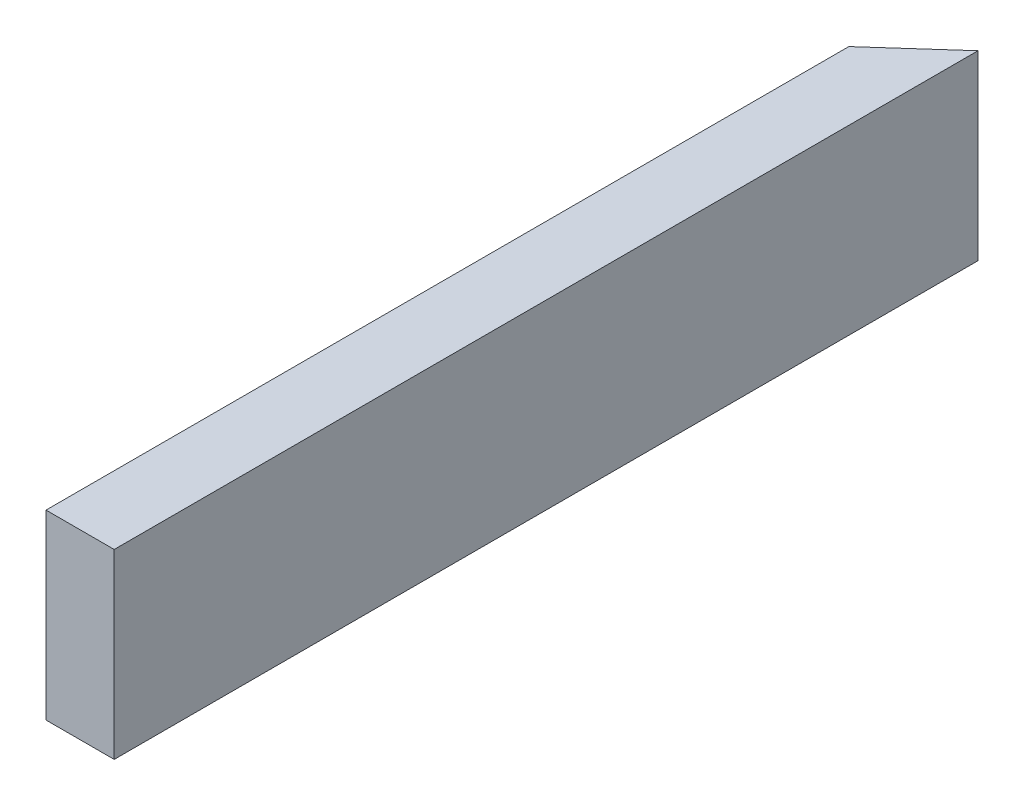
ISO-10303-21;
HEADER;
FILE_DESCRIPTION(('STEP AP214'),'2;1');
FILE_NAME('part.step','',(''),(''),'','','');
FILE_SCHEMA(('AUTOMOTIVE_DESIGN { 1 0 10303 214 1 1 1 1 }'));
ENDSEC;
DATA;
#1=APPLICATION_CONTEXT('core data for automotive mechanical design processes');
#2=APPLICATION_PROTOCOL_DEFINITION('international standard','automotive_design',2000,#1);
#3=PRODUCT_CONTEXT('',#1,'mechanical');
#4=PRODUCT('Part','Part','',(#3));
#5=PRODUCT_RELATED_PRODUCT_CATEGORY('part','',(#4));
#6=PRODUCT_DEFINITION_FORMATION('','',#4);
#7=PRODUCT_DEFINITION_CONTEXT('part definition',#1,'design');
#8=PRODUCT_DEFINITION('design','',#6,#7);
#9=PRODUCT_DEFINITION_SHAPE('','',#8);
#10=(LENGTH_UNIT() NAMED_UNIT(*) SI_UNIT(.MILLI.,.METRE.));
#11=(NAMED_UNIT(*) PLANE_ANGLE_UNIT() SI_UNIT($,.RADIAN.));
#12=(NAMED_UNIT(*) SI_UNIT($,.STERADIAN.) SOLID_ANGLE_UNIT());
#13=UNCERTAINTY_MEASURE_WITH_UNIT(LENGTH_MEASURE(1.E-05),#10,'distance_accuracy_value','');
#14=(GEOMETRIC_REPRESENTATION_CONTEXT(3) GLOBAL_UNCERTAINTY_ASSIGNED_CONTEXT((#13)) GLOBAL_UNIT_ASSIGNED_CONTEXT((#10,
#11,#12)) REPRESENTATION_CONTEXT('',''));
#15=CARTESIAN_POINT('',(0.,0.,0.));
#16=DIRECTION('',(0.,0.,1.));
#17=DIRECTION('',(1.,0.,0.));
#18=AXIS2_PLACEMENT_3D('',#15,#16,#17);
#19=CARTESIAN_POINT('',(-3.9032258064516,12.8387096774193,38.));
#20=DIRECTION('',(1.,0.,0.));
#21=DIRECTION('',(0.,1.,0.));
#22=AXIS2_PLACEMENT_3D('',#19,#20,#21);
#23=PLANE('',#22);
#24=DIRECTION('',(0.,0.,-1.));
#25=VECTOR('',#24,1.);
#26=CARTESIAN_POINT('',(-3.9032258064516,12.8387096774193,38.));
#27=LINE('',#26,#25);
#28=CARTESIAN_POINT('',(-3.9032258064516,12.8387096774193,38.));
#29=VERTEX_POINT('',#28);
#30=CARTESIAN_POINT('',(-3.9032258064516,12.8387096774193,2.68230957347922));
#31=VERTEX_POINT('',#30);
#32=EDGE_CURVE('E85',#29,#31,#27,.T.);
#33=ORIENTED_EDGE('',*,*,#32,.T.);
#34=DIRECTION('',(0.,1.,0.));
#35=VECTOR('',#34,1.);
#36=CARTESIAN_POINT('',(-3.9032258064516,-39.1612903225807,2.68230957347922));
#37=LINE('',#36,#35);
#38=CARTESIAN_POINT('',(-3.9032258064516,4.83870967741931,2.68230957347922));
#39=VERTEX_POINT('',#38);
#40=EDGE_CURVE('E71',#39,#31,#37,.T.);
#41=ORIENTED_EDGE('',*,*,#40,.F.);
#42=DIRECTION('',(0.,0.,-1.));
#43=VECTOR('',#42,1.);
#44=CARTESIAN_POINT('',(-3.9032258064516,4.83870967741933,38.));
#45=LINE('',#44,#43);
#46=CARTESIAN_POINT('',(-3.9032258064516,4.83870967741933,38.));
#47=VERTEX_POINT('',#46);
#48=EDGE_CURVE('E11',#47,#39,#45,.T.);
#49=ORIENTED_EDGE('',*,*,#48,.F.);
#50=DIRECTION('',(0.,-1.,0.));
#51=VECTOR('',#50,1.);
#52=CARTESIAN_POINT('',(-3.9032258064516,12.8387096774193,38.));
#53=LINE('',#52,#51);
#54=EDGE_CURVE('E90',#29,#47,#53,.T.);
#55=ORIENTED_EDGE('',*,*,#54,.F.);
#56=EDGE_LOOP('',(#33,#41,#49,#55));
#57=FACE_BOUND('',#56,.T.);
#58=ADVANCED_FACE('F35',(#57),#23,.F.);
#59=CARTESIAN_POINT('',(-3.9032258064516,4.83870967741933,38.));
#60=DIRECTION('',(0.,1.,0.));
#61=DIRECTION('',(0.,0.,1.));
#62=AXIS2_PLACEMENT_3D('',#59,#60,#61);
#63=PLANE('',#62);
#64=ORIENTED_EDGE('',*,*,#48,.T.);
#65=DIRECTION('',(0.745475999682867,0.,-0.666532470249448));
#66=VECTOR('',#65,1.);
#67=CARTESIAN_POINT('',(-21.4520196688124,4.83870967741933,18.3727421668205));
#68=LINE('',#67,#66);
#69=CARTESIAN_POINT('',(-0.9032258064516,4.83870967741931,0.));
#70=VERTEX_POINT('',#69);
#71=EDGE_CURVE('E77',#39,#70,#68,.T.);
#72=ORIENTED_EDGE('',*,*,#71,.T.);
#73=DIRECTION('',(0.,0.,-1.));
#74=VECTOR('',#73,1.);
#75=CARTESIAN_POINT('',(-0.903225806451599,4.83870967741933,38.));
#76=LINE('',#75,#74);
#77=CARTESIAN_POINT('',(-0.903225806451599,4.83870967741933,38.));
#78=VERTEX_POINT('',#77);
#79=EDGE_CURVE('E43',#78,#70,#76,.T.);
#80=ORIENTED_EDGE('',*,*,#79,.F.);
#81=DIRECTION('',(1.,0.,0.));
#82=VECTOR('',#81,1.);
#83=CARTESIAN_POINT('',(-3.9032258064516,4.83870967741933,38.));
#84=LINE('',#83,#82);
#85=EDGE_CURVE('E104',#47,#78,#84,.T.);
#86=ORIENTED_EDGE('',*,*,#85,.F.);
#87=EDGE_LOOP('',(#64,#72,#80,#86));
#88=FACE_BOUND('',#87,.T.);
#89=ADVANCED_FACE('F103',(#88),#63,.F.);
#90=CARTESIAN_POINT('',(-0.9032258064516,12.8387096774193,38.));
#91=DIRECTION('',(-1.,0.,0.));
#92=DIRECTION('',(0.,-1.,0.));
#93=AXIS2_PLACEMENT_3D('',#90,#91,#92);
#94=PLANE('',#93);
#95=DIRECTION('',(0.,1.,0.));
#96=VECTOR('',#95,1.);
#97=CARTESIAN_POINT('',(-0.9032258064516,12.8387096774193,0.));
#98=LINE('',#97,#96);
#99=CARTESIAN_POINT('',(-0.9032258064516,12.8387096774193,0.));
#100=VERTEX_POINT('',#99);
#101=EDGE_CURVE('E96',#70,#100,#98,.T.);
#102=ORIENTED_EDGE('',*,*,#101,.T.);
#103=DIRECTION('',(0.,0.,-1.));
#104=VECTOR('',#103,1.);
#105=CARTESIAN_POINT('',(-0.9032258064516,12.8387096774193,38.));
#106=LINE('',#105,#104);
#107=CARTESIAN_POINT('',(-0.9032258064516,12.8387096774193,38.));
#108=VERTEX_POINT('',#107);
#109=EDGE_CURVE('E88',#108,#100,#106,.T.);
#110=ORIENTED_EDGE('',*,*,#109,.F.);
#111=DIRECTION('',(0.,1.,0.));
#112=VECTOR('',#111,1.);
#113=CARTESIAN_POINT('',(-0.9032258064516,12.8387096774193,38.));
#114=LINE('',#113,#112);
#115=EDGE_CURVE('E93',#78,#108,#114,.T.);
#116=ORIENTED_EDGE('',*,*,#115,.F.);
#117=ORIENTED_EDGE('',*,*,#79,.T.);
#118=EDGE_LOOP('',(#102,#110,#116,#117));
#119=FACE_BOUND('',#118,.T.);
#120=ADVANCED_FACE('F101',(#119),#94,.F.);
#121=CARTESIAN_POINT('',(-3.9032258064516,12.8387096774193,38.));
#122=DIRECTION('',(0.,-1.,0.));
#123=DIRECTION('',(0.,0.,-1.));
#124=AXIS2_PLACEMENT_3D('',#121,#122,#123);
#125=PLANE('',#124);
#126=ORIENTED_EDGE('',*,*,#109,.T.);
#127=DIRECTION('',(0.745475999682867,0.,-0.666532470249448));
#128=VECTOR('',#127,1.);
#129=CARTESIAN_POINT('',(-0.9032258064516,12.8387096774193,0.));
#130=LINE('',#129,#128);
#131=EDGE_CURVE('E74',#31,#100,#130,.T.);
#132=ORIENTED_EDGE('',*,*,#131,.F.);
#133=ORIENTED_EDGE('',*,*,#32,.F.);
#134=DIRECTION('',(-1.,0.,0.));
#135=VECTOR('',#134,1.);
#136=CARTESIAN_POINT('',(-3.9032258064516,12.8387096774193,38.));
#137=LINE('',#136,#135);
#138=EDGE_CURVE('E50',#108,#29,#137,.T.);
#139=ORIENTED_EDGE('',*,*,#138,.F.);
#140=EDGE_LOOP('',(#126,#132,#133,#139));
#141=FACE_BOUND('',#140,.T.);
#142=ADVANCED_FACE('F84',(#141),#125,.F.);
#143=CARTESIAN_POINT('',(0.,0.,38.));
#144=DIRECTION('',(0.,0.,1.));
#145=DIRECTION('',(1.,0.,0.));
#146=AXIS2_PLACEMENT_3D('',#143,#144,#145);
#147=PLANE('',#146);
#148=ORIENTED_EDGE('',*,*,#54,.T.);
#149=ORIENTED_EDGE('',*,*,#85,.T.);
#150=ORIENTED_EDGE('',*,*,#115,.T.);
#151=ORIENTED_EDGE('',*,*,#138,.T.);
#152=EDGE_LOOP('',(#148,#149,#150,#151));
#153=FACE_BOUND('',#152,.T.);
#154=ADVANCED_FACE('F109',(#153),#147,.T.);
#155=CARTESIAN_POINT('',(-0.9032258064516,-39.1612903225807,0.));
#156=DIRECTION('',(0.666532470249447,0.,0.745475999682867));
#157=DIRECTION('',(0.745475999682867,0.,-0.666532470249448));
#158=AXIS2_PLACEMENT_3D('',#155,#156,#157);
#159=PLANE('',#158);
#160=ORIENTED_EDGE('',*,*,#40,.T.);
#161=ORIENTED_EDGE('',*,*,#131,.T.);
#162=ORIENTED_EDGE('',*,*,#101,.F.);
#163=ORIENTED_EDGE('',*,*,#71,.F.);
#164=EDGE_LOOP('',(#160,#161,#162,#163));
#165=FACE_BOUND('',#164,.T.);
#166=ADVANCED_FACE('F73',(#165),#159,.F.);
#167=CLOSED_SHELL('',(#58,#89,#120,#142,#154,#166));
#168=MANIFOLD_SOLID_BREP('B2',#167);
#169=ADVANCED_BREP_SHAPE_REPRESENTATION('',(#18,#168),#14);
#170=SHAPE_DEFINITION_REPRESENTATION(#9,#169);
ENDSEC;
END-ISO-10303-21;
